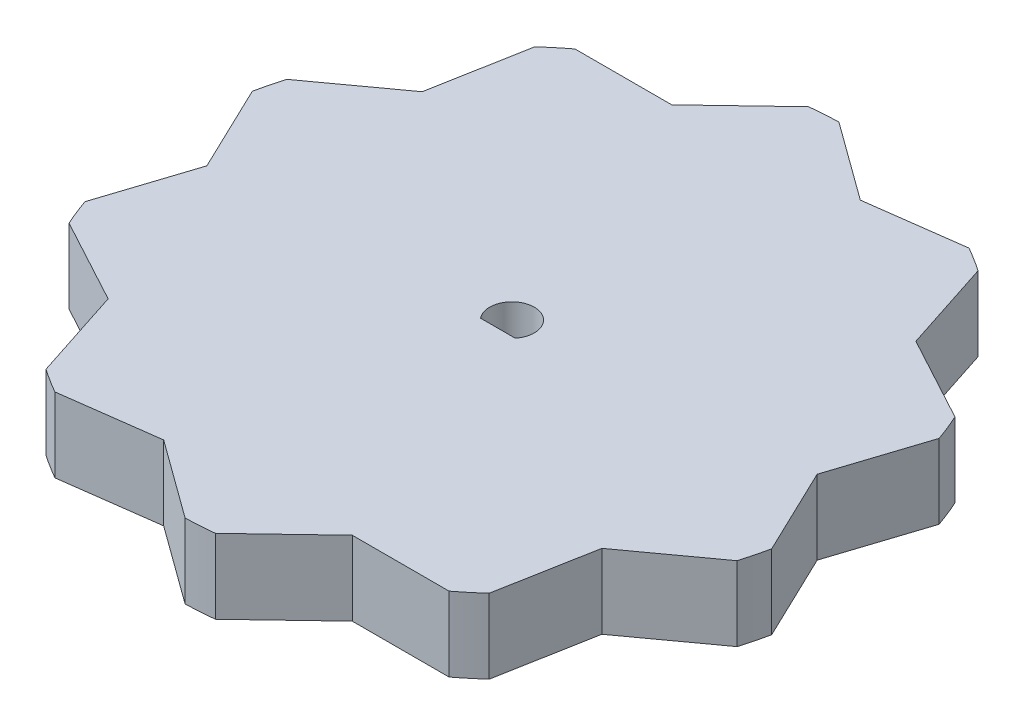
ISO-10303-21;
HEADER;
FILE_DESCRIPTION(('STEP AP214'),'2;1');
FILE_NAME('part.step','',(''),(''),'','','');
FILE_SCHEMA(('AUTOMOTIVE_DESIGN { 1 0 10303 214 1 1 1 1 }'));
ENDSEC;
DATA;
#1=APPLICATION_CONTEXT('core data for automotive mechanical design processes');
#2=APPLICATION_PROTOCOL_DEFINITION('international standard','automotive_design',2000,#1);
#3=PRODUCT_CONTEXT('',#1,'mechanical');
#4=PRODUCT('Part','Part','',(#3));
#5=PRODUCT_RELATED_PRODUCT_CATEGORY('part','',(#4));
#6=PRODUCT_DEFINITION_FORMATION('','',#4);
#7=PRODUCT_DEFINITION_CONTEXT('part definition',#1,'design');
#8=PRODUCT_DEFINITION('design','',#6,#7);
#9=PRODUCT_DEFINITION_SHAPE('','',#8);
#10=(LENGTH_UNIT() NAMED_UNIT(*) SI_UNIT(.MILLI.,.METRE.));
#11=(NAMED_UNIT(*) PLANE_ANGLE_UNIT() SI_UNIT($,.RADIAN.));
#12=(NAMED_UNIT(*) SI_UNIT($,.STERADIAN.) SOLID_ANGLE_UNIT());
#13=UNCERTAINTY_MEASURE_WITH_UNIT(LENGTH_MEASURE(1.E-05),#10,'distance_accuracy_value','');
#14=(GEOMETRIC_REPRESENTATION_CONTEXT(3) GLOBAL_UNCERTAINTY_ASSIGNED_CONTEXT((#13)) GLOBAL_UNIT_ASSIGNED_CONTEXT((#10,
#11,#12)) REPRESENTATION_CONTEXT('',''));
#15=CARTESIAN_POINT('',(0.,0.,0.));
#16=DIRECTION('',(0.,0.,1.));
#17=DIRECTION('',(1.,0.,0.));
#18=AXIS2_PLACEMENT_3D('',#15,#16,#17);
#19=CARTESIAN_POINT('',(0.,5.,0.));
#20=DIRECTION('',(0.,-1.,0.));
#21=DIRECTION('',(0.,0.,-1.));
#22=AXIS2_PLACEMENT_3D('',#19,#20,#21);
#23=CYLINDRICAL_SURFACE('',#22,22.5);
#24=CARTESIAN_POINT('',(0.,5.,0.));
#25=DIRECTION('',(0.,1.,0.));
#26=DIRECTION('',(0.,0.,1.));
#27=AXIS2_PLACEMENT_3D('',#24,#25,#26);
#28=CIRCLE('',#27,22.5);
#29=CARTESIAN_POINT('',(-21.5580930554665,5.,-6.44194254956119));
#30=VERTEX_POINT('',#29);
#31=CARTESIAN_POINT('',(-22.0282088774238,5.,-4.58344997273761));
#32=VERTEX_POINT('',#31);
#33=EDGE_CURVE('E446',#30,#32,#28,.T.);
#34=ORIENTED_EDGE('',*,*,#33,.F.);
#35=DIRECTION('',(0.,-1.,0.));
#36=VECTOR('',#35,1.);
#37=CARTESIAN_POINT('',(-21.5580930554665,84.7946583425231,-6.44194254956119));
#38=LINE('',#37,#36);
#39=CARTESIAN_POINT('',(-21.5580930554665,0.,-6.44194254956119));
#40=VERTEX_POINT('',#39);
#41=EDGE_CURVE('E447',#30,#40,#38,.T.);
#42=ORIENTED_EDGE('',*,*,#41,.T.);
#43=CARTESIAN_POINT('',(0.,0.,0.));
#44=DIRECTION('',(0.,1.,0.));
#45=DIRECTION('',(0.,0.,1.));
#46=AXIS2_PLACEMENT_3D('',#43,#44,#45);
#47=CIRCLE('',#46,22.5);
#48=CARTESIAN_POINT('',(-22.0282088774238,0.,-4.58344997273761));
#49=VERTEX_POINT('',#48);
#50=EDGE_CURVE('E272',#40,#49,#47,.T.);
#51=ORIENTED_EDGE('',*,*,#50,.T.);
#52=DIRECTION('',(0.,-1.,0.));
#53=VECTOR('',#52,1.);
#54=CARTESIAN_POINT('',(-22.0282088774238,84.7946583425231,-4.58344997273761));
#55=LINE('',#54,#53);
#56=EDGE_CURVE('E440',#32,#49,#55,.T.);
#57=ORIENTED_EDGE('',*,*,#56,.F.);
#58=EDGE_LOOP('',(#34,#42,#51,#57));
#59=FACE_BOUND('',#58,.T.);
#60=ADVANCED_FACE('F36',(#59),#23,.T.);
#61=CARTESIAN_POINT('',(-15.1271110388814,84.7946583425231,-16.6559452333799));
#62=DIRECTION('',(0.983599775987346,0.,0.180364854330443));
#63=DIRECTION('',(0.180364854330443,0.,-0.983599775987346));
#64=AXIS2_PLACEMENT_3D('',#61,#62,#63);
#65=PLANE('',#64);
#66=DIRECTION('',(0.,-1.,0.));
#67=VECTOR('',#66,1.);
#68=CARTESIAN_POINT('',(-16.2994825920293,84.7946583425231,-10.2625466894622));
#69=LINE('',#68,#67);
#70=CARTESIAN_POINT('',(-16.2994825920293,5.,-10.2625466894622));
#71=VERTEX_POINT('',#70);
#72=CARTESIAN_POINT('',(-16.2994825920293,0.,-10.2625466894622));
#73=VERTEX_POINT('',#72);
#74=EDGE_CURVE('E452',#71,#73,#69,.T.);
#75=ORIENTED_EDGE('',*,*,#74,.F.);
#76=DIRECTION('',(0.180364854330443,0.,-0.983599775987346));
#77=VECTOR('',#76,1.);
#78=CARTESIAN_POINT('',(-17.5898821681726,5.,-3.22549538176483));
#79=LINE('',#78,#77);
#80=CARTESIAN_POINT('',(-15.1271110388814,5.,-16.6559452333799));
#81=VERTEX_POINT('',#80);
#82=EDGE_CURVE('E457',#71,#81,#79,.T.);
#83=ORIENTED_EDGE('',*,*,#82,.T.);
#84=DIRECTION('',(0.,-1.,0.));
#85=VECTOR('',#84,1.);
#86=CARTESIAN_POINT('',(-15.1271110388814,84.7946583425231,-16.6559452333799));
#87=LINE('',#86,#85);
#88=CARTESIAN_POINT('',(-15.1271110388814,0.,-16.6559452333799));
#89=VERTEX_POINT('',#88);
#90=EDGE_CURVE('E44',#81,#89,#87,.T.);
#91=ORIENTED_EDGE('',*,*,#90,.T.);
#92=DIRECTION('',(0.180364854330443,0.,-0.983599775987346));
#93=VECTOR('',#92,1.);
#94=CARTESIAN_POINT('',(-17.5898821681726,0.,-3.22549538176483));
#95=LINE('',#94,#93);
#96=EDGE_CURVE('E12',#73,#89,#95,.T.);
#97=ORIENTED_EDGE('',*,*,#96,.F.);
#98=EDGE_LOOP('',(#75,#83,#91,#97));
#99=FACE_BOUND('',#98,.T.);
#100=ADVANCED_FACE('F38',(#99),#65,.F.);
#101=CARTESIAN_POINT('',(-16.2994825920293,84.7946583425231,-10.2625466894622));
#102=DIRECTION('',(0.587785252292462,0.,0.809016994374956));
#103=DIRECTION('',(0.809016994374956,0.,-0.587785252292462));
#104=AXIS2_PLACEMENT_3D('',#101,#102,#103);
#105=PLANE('',#104);
#106=ORIENTED_EDGE('',*,*,#41,.F.);
#107=DIRECTION('',(0.809016994374956,0.,-0.587785252292462));
#108=VECTOR('',#107,1.);
#109=CARTESIAN_POINT('',(-10.5114636871847,5.,-14.4677885767307));
#110=LINE('',#109,#108);
#111=EDGE_CURVE('E450',#30,#71,#110,.T.);
#112=ORIENTED_EDGE('',*,*,#111,.T.);
#113=ORIENTED_EDGE('',*,*,#74,.T.);
#114=DIRECTION('',(0.809016994374956,0.,-0.587785252292462));
#115=VECTOR('',#114,1.);
#116=CARTESIAN_POINT('',(-10.5114636871847,0.,-14.4677885767307));
#117=LINE('',#116,#115);
#118=EDGE_CURVE('E454',#40,#73,#117,.T.);
#119=ORIENTED_EDGE('',*,*,#118,.F.);
#120=EDGE_LOOP('',(#106,#112,#113,#119));
#121=FACE_BOUND('',#120,.T.);
#122=ADVANCED_FACE('F467',(#121),#105,.F.);
#123=CARTESIAN_POINT('',(-21.2273424749364,5.,7.4598881661699));
#124=VERTEX_POINT('',#123);
#125=CARTESIAN_POINT('',(-20.5152796360724,5.,9.23976739175571));
#126=VERTEX_POINT('',#125);
#127=EDGE_CURVE('E425',#124,#126,#28,.T.);
#128=ORIENTED_EDGE('',*,*,#127,.F.);
#129=DIRECTION('',(0.,-1.,0.));
#130=VECTOR('',#129,1.);
#131=CARTESIAN_POINT('',(-21.2273424749364,84.7946583425231,7.4598881661699));
#132=LINE('',#131,#130);
#133=CARTESIAN_POINT('',(-21.2273424749364,0.,7.4598881661699));
#134=VERTEX_POINT('',#133);
#135=EDGE_CURVE('E426',#124,#134,#132,.T.);
#136=ORIENTED_EDGE('',*,*,#135,.T.);
#137=CARTESIAN_POINT('',(-20.5152796360724,0.,9.23976739175571));
#138=VERTEX_POINT('',#137);
#139=EDGE_CURVE('E430',#134,#138,#47,.T.);
#140=ORIENTED_EDGE('',*,*,#139,.T.);
#141=DIRECTION('',(0.,-1.,0.));
#142=VECTOR('',#141,1.);
#143=CARTESIAN_POINT('',(-20.5152796360724,84.7946583425231,9.23976739175571));
#144=LINE('',#143,#142);
#145=EDGE_CURVE('E419',#126,#138,#144,.T.);
#146=ORIENTED_EDGE('',*,*,#145,.F.);
#147=EDGE_LOOP('',(#128,#136,#140,#146));
#148=FACE_BOUND('',#147,.T.);
#149=ADVANCED_FACE('F540',(#148),#23,.T.);
#150=CARTESIAN_POINT('',(-22.0282088774238,84.7946583425231,-4.58344997273761));
#151=DIRECTION('',(0.901764735844469,0.,-0.432227210142252));
#152=DIRECTION('',(-0.432227210142252,0.,-0.901764735844469));
#153=AXIS2_PLACEMENT_3D('',#150,#151,#152);
#154=PLANE('',#153);
#155=DIRECTION('',(0.,-1.,0.));
#156=VECTOR('',#155,1.);
#157=CARTESIAN_POINT('',(-19.2187320114991,84.7946583425231,1.27802081025144));
#158=LINE('',#157,#156);
#159=CARTESIAN_POINT('',(-19.2187320114991,5.,1.27802081025144));
#160=VERTEX_POINT('',#159);
#161=CARTESIAN_POINT('',(-19.2187320114991,0.,1.27802081025144));
#162=VERTEX_POINT('',#161);
#163=EDGE_CURVE('E432',#160,#162,#158,.T.);
#164=ORIENTED_EDGE('',*,*,#163,.F.);
#165=DIRECTION('',(-0.432227210142252,0.,-0.901764735844469));
#166=VECTOR('',#165,1.);
#167=CARTESIAN_POINT('',(-16.1264122198433,5.,7.72959274888853));
#168=LINE('',#167,#166);
#169=EDGE_CURVE('E437',#160,#32,#168,.T.);
#170=ORIENTED_EDGE('',*,*,#169,.T.);
#171=ORIENTED_EDGE('',*,*,#56,.T.);
#172=DIRECTION('',(-0.432227210142252,0.,-0.901764735844469));
#173=VECTOR('',#172,1.);
#174=CARTESIAN_POINT('',(-16.1264122198433,0.,7.72959274888853));
#175=LINE('',#174,#173);
#176=EDGE_CURVE('E443',#162,#49,#175,.T.);
#177=ORIENTED_EDGE('',*,*,#176,.F.);
#178=EDGE_LOOP('',(#164,#170,#171,#177));
#179=FACE_BOUND('',#178,.T.);
#180=ADVANCED_FACE('F478',(#179),#154,.F.);
#181=CARTESIAN_POINT('',(-19.2187320114991,84.7946583425231,1.27802081025144));
#182=DIRECTION('',(0.951056516295149,0.,0.309016994374961));
#183=DIRECTION('',(0.309016994374961,0.,-0.951056516295149));
#184=AXIS2_PLACEMENT_3D('',#181,#182,#183);
#185=PLANE('',#184);
#186=ORIENTED_EDGE('',*,*,#135,.F.);
#187=DIRECTION('',(0.309016994374961,0.,-0.951056516295149));
#188=VECTOR('',#187,1.);
#189=CARTESIAN_POINT('',(-17.0079055173754,5.,-5.52620349426384));
#190=LINE('',#189,#188);
#191=EDGE_CURVE('E429',#124,#160,#190,.T.);
#192=ORIENTED_EDGE('',*,*,#191,.T.);
#193=ORIENTED_EDGE('',*,*,#163,.T.);
#194=DIRECTION('',(0.309016994374961,0.,-0.951056516295149));
#195=VECTOR('',#194,1.);
#196=CARTESIAN_POINT('',(-17.0079055173754,0.,-5.52620349426384));
#197=LINE('',#196,#195);
#198=EDGE_CURVE('E434',#134,#162,#197,.T.);
#199=ORIENTED_EDGE('',*,*,#198,.F.);
#200=EDGE_LOOP('',(#186,#192,#193,#199));
#201=FACE_BOUND('',#200,.T.);
#202=ADVANCED_FACE('F551',(#201),#185,.F.);
#203=CARTESIAN_POINT('',(-12.7884685598149,5.,18.5122951546972));
#204=VERTEX_POINT('',#203);
#205=CARTESIAN_POINT('',(-11.16621086245,5.,19.5337076607413));
#206=VERTEX_POINT('',#205);
#207=EDGE_CURVE('E404',#204,#206,#28,.T.);
#208=ORIENTED_EDGE('',*,*,#207,.F.);
#209=DIRECTION('',(0.,-1.,0.));
#210=VECTOR('',#209,1.);
#211=CARTESIAN_POINT('',(-12.7884685598149,84.7946583425231,18.5122951546972));
#212=LINE('',#211,#210);
#213=CARTESIAN_POINT('',(-12.7884685598149,0.,18.5122951546972));
#214=VERTEX_POINT('',#213);
#215=EDGE_CURVE('E405',#204,#214,#212,.T.);
#216=ORIENTED_EDGE('',*,*,#215,.T.);
#217=CARTESIAN_POINT('',(-11.16621086245,0.,19.5337076607413));
#218=VERTEX_POINT('',#217);
#219=EDGE_CURVE('E409',#214,#218,#47,.T.);
#220=ORIENTED_EDGE('',*,*,#219,.T.);
#221=DIRECTION('',(0.,-1.,0.));
#222=VECTOR('',#221,1.);
#223=CARTESIAN_POINT('',(-11.16621086245,84.7946583425231,19.5337076607413));
#224=LINE('',#223,#222);
#225=EDGE_CURVE('E398',#206,#218,#224,.T.);
#226=ORIENTED_EDGE('',*,*,#225,.F.);
#227=EDGE_LOOP('',(#208,#216,#220,#226));
#228=FACE_BOUND('',#227,.T.);
#229=ADVANCED_FACE('F546',(#228),#23,.T.);
#230=CARTESIAN_POINT('',(-20.5152796360724,84.7946583425231,9.23976739175571));
#231=DIRECTION('',(0.475486216465076,0.,-0.87972317120315));
#232=DIRECTION('',(-0.87972317120315,0.,-0.475486216465076));
#233=AXIS2_PLACEMENT_3D('',#230,#231,#232);
#234=PLANE('',#233);
#235=DIRECTION('',(0.,-1.,0.));
#236=VECTOR('',#235,1.);
#237=CARTESIAN_POINT('',(-14.7970790232519,84.7946583425231,12.3304277987787));
#238=LINE('',#237,#236);
#239=CARTESIAN_POINT('',(-14.7970790232519,5.,12.3304277987787));
#240=VERTEX_POINT('',#239);
#241=CARTESIAN_POINT('',(-14.7970790232519,0.,12.3304277987787));
#242=VERTEX_POINT('',#241);
#243=EDGE_CURVE('E411',#240,#242,#238,.T.);
#244=ORIENTED_EDGE('',*,*,#243,.F.);
#245=DIRECTION('',(-0.87972317120315,0.,-0.475486216465076));
#246=VECTOR('',#245,1.);
#247=CARTESIAN_POINT('',(-8.50320092012553,5.,15.7322391686612));
#248=LINE('',#247,#246);
#249=EDGE_CURVE('E416',#240,#126,#248,.T.);
#250=ORIENTED_EDGE('',*,*,#249,.T.);
#251=ORIENTED_EDGE('',*,*,#145,.T.);
#252=DIRECTION('',(-0.87972317120315,0.,-0.475486216465076));
#253=VECTOR('',#252,1.);
#254=CARTESIAN_POINT('',(-8.50320092012553,0.,15.7322391686612));
#255=LINE('',#254,#253);
#256=EDGE_CURVE('E422',#242,#138,#255,.T.);
#257=ORIENTED_EDGE('',*,*,#256,.F.);
#258=EDGE_LOOP('',(#244,#250,#251,#257));
#259=FACE_BOUND('',#258,.T.);
#260=ADVANCED_FACE('F554',(#259),#234,.F.);
#261=CARTESIAN_POINT('',(-14.7970790232519,84.7946583425231,12.3304277987787));
#262=DIRECTION('',(0.951056516295158,0.,-0.309016994374934));
#263=DIRECTION('',(-0.309016994374934,0.,-0.951056516295158));
#264=AXIS2_PLACEMENT_3D('',#261,#262,#263);
#265=PLANE('',#264);
#266=ORIENTED_EDGE('',*,*,#215,.F.);
#267=DIRECTION('',(-0.309016994374934,0.,-0.951056516295158));
#268=VECTOR('',#267,1.);
#269=CARTESIAN_POINT('',(-17.0079055173755,5.,5.52620349426336));
#270=LINE('',#269,#268);
#271=EDGE_CURVE('E408',#204,#240,#270,.T.);
#272=ORIENTED_EDGE('',*,*,#271,.T.);
#273=ORIENTED_EDGE('',*,*,#243,.T.);
#274=DIRECTION('',(-0.309016994374934,0.,-0.951056516295158));
#275=VECTOR('',#274,1.);
#276=CARTESIAN_POINT('',(-17.0079055173755,0.,5.52620349426336));
#277=LINE('',#276,#275);
#278=EDGE_CURVE('E413',#214,#242,#277,.T.);
#279=ORIENTED_EDGE('',*,*,#278,.F.);
#280=EDGE_LOOP('',(#266,#272,#273,#279));
#281=FACE_BOUND('',#280,.T.);
#282=ADVANCED_FACE('F560',(#281),#265,.F.);
#283=CARTESIAN_POINT('',(0.535165681096494,5.,22.4936346039002));
#284=VERTEX_POINT('',#283);
#285=CARTESIAN_POINT('',(2.44797093508008,5.,22.3664355296279));
#286=VERTEX_POINT('',#285);
#287=EDGE_CURVE('E383',#284,#286,#28,.T.);
#288=ORIENTED_EDGE('',*,*,#287,.F.);
#289=DIRECTION('',(0.,-1.,0.));
#290=VECTOR('',#289,1.);
#291=CARTESIAN_POINT('',(0.535165681096494,84.7946583425231,22.4936346039002));
#292=LINE('',#291,#290);
#293=CARTESIAN_POINT('',(0.535165681096494,0.,22.4936346039002));
#294=VERTEX_POINT('',#293);
#295=EDGE_CURVE('E384',#284,#294,#292,.T.);
#296=ORIENTED_EDGE('',*,*,#295,.T.);
#297=CARTESIAN_POINT('',(2.44797093508008,0.,22.3664355296279));
#298=VERTEX_POINT('',#297);
#299=EDGE_CURVE('E388',#294,#298,#47,.T.);
#300=ORIENTED_EDGE('',*,*,#299,.T.);
#301=DIRECTION('',(0.,-1.,0.));
#302=VECTOR('',#301,1.);
#303=CARTESIAN_POINT('',(2.44797093508008,84.7946583425231,22.3664355296279));
#304=LINE('',#303,#302);
#305=EDGE_CURVE('E377',#286,#298,#304,.T.);
#306=ORIENTED_EDGE('',*,*,#305,.F.);
#307=EDGE_LOOP('',(#288,#296,#300,#306));
#308=FACE_BOUND('',#307,.T.);
#309=ADVANCED_FACE('F555',(#308),#23,.T.);
#310=CARTESIAN_POINT('',(-11.16621086245,84.7946583425231,19.5337076607413));
#311=DIRECTION('',(-0.132411876421887,0.,-0.991194781555288));
#312=DIRECTION('',(-0.991194781555288,0.,0.132411876421887));
#313=AXIS2_PLACEMENT_3D('',#310,#311,#312);
#314=PLANE('',#313);
#315=DIRECTION('',(0.,-1.,0.));
#316=VECTOR('',#315,1.);
#317=CARTESIAN_POINT('',(-4.72344478234061,84.7946583425231,18.6730304639991));
#318=LINE('',#317,#316);
#319=CARTESIAN_POINT('',(-4.72344478234061,5.,18.6730304639991));
#320=VERTEX_POINT('',#319);
#321=CARTESIAN_POINT('',(-4.72344478234061,0.,18.6730304639991));
#322=VERTEX_POINT('',#321);
#323=EDGE_CURVE('E390',#320,#322,#318,.T.);
#324=ORIENTED_EDGE('',*,*,#323,.F.);
#325=DIRECTION('',(-0.991194781555288,0.,0.132411876421887));
#326=VECTOR('',#325,1.);
#327=CARTESIAN_POINT('',(2.3679441179108,5.,17.7257049451477));
#328=LINE('',#327,#326);
#329=EDGE_CURVE('E395',#320,#206,#328,.T.);
#330=ORIENTED_EDGE('',*,*,#329,.T.);
#331=ORIENTED_EDGE('',*,*,#225,.T.);
#332=DIRECTION('',(-0.991194781555288,0.,0.132411876421887));
#333=VECTOR('',#332,1.);
#334=CARTESIAN_POINT('',(2.3679441179108,0.,17.7257049451477));
#335=LINE('',#334,#333);
#336=EDGE_CURVE('E401',#322,#218,#335,.T.);
#337=ORIENTED_EDGE('',*,*,#336,.F.);
#338=EDGE_LOOP('',(#324,#330,#331,#337));
#339=FACE_BOUND('',#338,.T.);
#340=ADVANCED_FACE('F566',(#339),#314,.F.);
#341=CARTESIAN_POINT('',(-4.72344478234061,84.7946583425231,18.6730304639991));
#342=DIRECTION('',(0.587785252292485,0.,-0.809016994374939));
#343=DIRECTION('',(-0.809016994374939,0.,-0.587785252292485));
#344=AXIS2_PLACEMENT_3D('',#341,#342,#343);
#345=PLANE('',#344);
#346=ORIENTED_EDGE('',*,*,#295,.F.);
#347=DIRECTION('',(-0.809016994374939,0.,-0.587785252292485));
#348=VECTOR('',#347,1.);
#349=CARTESIAN_POINT('',(-10.5114636871851,5.,14.4677885767304));
#350=LINE('',#349,#348);
#351=EDGE_CURVE('E387',#284,#320,#350,.T.);
#352=ORIENTED_EDGE('',*,*,#351,.T.);
#353=ORIENTED_EDGE('',*,*,#323,.T.);
#354=DIRECTION('',(-0.809016994374939,0.,-0.587785252292485));
#355=VECTOR('',#354,1.);
#356=CARTESIAN_POINT('',(-10.5114636871851,0.,14.4677885767304));
#357=LINE('',#356,#355);
#358=EDGE_CURVE('E392',#294,#322,#357,.T.);
#359=ORIENTED_EDGE('',*,*,#358,.F.);
#360=EDGE_LOOP('',(#346,#352,#353,#359));
#361=FACE_BOUND('',#360,.T.);
#362=ADVANCED_FACE('F572',(#361),#345,.F.);
#363=CARTESIAN_POINT('',(13.6543848214415,5.,17.8831701649341));
#364=VERTEX_POINT('',#363);
#365=CARTESIAN_POINT('',(15.1271110388816,5.,16.6559452333797));
#366=VERTEX_POINT('',#365);
#367=EDGE_CURVE('E362',#364,#366,#28,.T.);
#368=ORIENTED_EDGE('',*,*,#367,.F.);
#369=DIRECTION('',(0.,-1.,0.));
#370=VECTOR('',#369,1.);
#371=CARTESIAN_POINT('',(13.6543848214415,84.7946583425231,17.8831701649341));
#372=LINE('',#371,#370);
#373=CARTESIAN_POINT('',(13.6543848214415,0.,17.8831701649341));
#374=VERTEX_POINT('',#373);
#375=EDGE_CURVE('E363',#364,#374,#372,.T.);
#376=ORIENTED_EDGE('',*,*,#375,.T.);
#377=CARTESIAN_POINT('',(15.1271110388816,0.,16.6559452333797));
#378=VERTEX_POINT('',#377);
#379=EDGE_CURVE('E367',#374,#378,#47,.T.);
#380=ORIENTED_EDGE('',*,*,#379,.T.);
#381=DIRECTION('',(0.,-1.,0.));
#382=VECTOR('',#381,1.);
#383=CARTESIAN_POINT('',(15.1271110388816,84.7946583425231,16.6559452333797));
#384=LINE('',#383,#382);
#385=EDGE_CURVE('E356',#366,#378,#384,.T.);
#386=ORIENTED_EDGE('',*,*,#385,.F.);
#387=EDGE_LOOP('',(#368,#376,#380,#386));
#388=FACE_BOUND('',#387,.T.);
#389=ADVANCED_FACE('F567',(#388),#23,.T.);
#390=CARTESIAN_POINT('',(2.44797093508008,84.7946583425231,22.3664355296279));
#391=DIRECTION('',(-0.68973313302984,0.,-0.724063674824833));
#392=DIRECTION('',(-0.724063674824833,0.,0.68973313302984));
#393=AXIS2_PLACEMENT_3D('',#390,#391,#392);
#394=PLANE('',#393);
#395=DIRECTION('',(0.,-1.,0.));
#396=VECTOR('',#395,1.);
#397=CARTESIAN_POINT('',(7.15438482144149,84.7946583425231,17.883170164934));
#398=LINE('',#397,#396);
#399=CARTESIAN_POINT('',(7.15438482144149,5.,17.883170164934));
#400=VERTEX_POINT('',#399);
#401=CARTESIAN_POINT('',(7.15438482144149,0.,17.883170164934));
#402=VERTEX_POINT('',#401);
#403=EDGE_CURVE('E369',#400,#402,#398,.T.);
#404=ORIENTED_EDGE('',*,*,#403,.F.);
#405=DIRECTION('',(-0.724063674824833,0.,0.68973313302984));
#406=VECTOR('',#405,1.);
#407=CARTESIAN_POINT('',(12.3346149863656,5.,12.9485539071398));
#408=LINE('',#407,#406);
#409=EDGE_CURVE('E374',#400,#286,#408,.T.);
#410=ORIENTED_EDGE('',*,*,#409,.T.);
#411=ORIENTED_EDGE('',*,*,#305,.T.);
#412=DIRECTION('',(-0.724063674824833,0.,0.68973313302984));
#413=VECTOR('',#412,1.);
#414=CARTESIAN_POINT('',(12.3346149863656,0.,12.9485539071398));
#415=LINE('',#414,#413);
#416=EDGE_CURVE('E380',#402,#298,#415,.T.);
#417=ORIENTED_EDGE('',*,*,#416,.F.);
#418=EDGE_LOOP('',(#404,#410,#411,#417));
#419=FACE_BOUND('',#418,.T.);
#420=ADVANCED_FACE('F578',(#419),#394,.F.);
#421=CARTESIAN_POINT('',(7.15438482144149,84.7946583425231,17.883170164934));
#422=DIRECTION('',(0.,0.,-1.));
#423=DIRECTION('',(-1.,0.,0.));
#424=AXIS2_PLACEMENT_3D('',#421,#422,#423);
#425=PLANE('',#424);
#426=ORIENTED_EDGE('',*,*,#375,.F.);
#427=DIRECTION('',(-1.,0.,0.));
#428=VECTOR('',#427,1.);
#429=CARTESIAN_POINT('',(-2.51945076351001E-13,5.,17.8831701649339));
#430=LINE('',#429,#428);
#431=EDGE_CURVE('E366',#364,#400,#430,.T.);
#432=ORIENTED_EDGE('',*,*,#431,.T.);
#433=ORIENTED_EDGE('',*,*,#403,.T.);
#434=DIRECTION('',(-1.,0.,0.));
#435=VECTOR('',#434,1.);
#436=CARTESIAN_POINT('',(-2.51945076351001E-13,0.,17.8831701649339));
#437=LINE('',#436,#435);
#438=EDGE_CURVE('E371',#374,#402,#437,.T.);
#439=ORIENTED_EDGE('',*,*,#438,.F.);
#440=EDGE_LOOP('',(#426,#432,#433,#439));
#441=FACE_BOUND('',#440,.T.);
#442=ADVANCED_FACE('F584',(#441),#425,.F.);
#443=CARTESIAN_POINT('',(21.5580930554666,5.,6.4419425495609));
#444=VERTEX_POINT('',#443);
#445=CARTESIAN_POINT('',(22.0282088774238,5.,4.58344997273731));
#446=VERTEX_POINT('',#445);
#447=EDGE_CURVE('E341',#444,#446,#28,.T.);
#448=ORIENTED_EDGE('',*,*,#447,.F.);
#449=DIRECTION('',(0.,-1.,0.));
#450=VECTOR('',#449,1.);
#451=CARTESIAN_POINT('',(21.5580930554666,84.7946583425231,6.4419425495609));
#452=LINE('',#451,#450);
#453=CARTESIAN_POINT('',(21.5580930554666,0.,6.4419425495609));
#454=VERTEX_POINT('',#453);
#455=EDGE_CURVE('E342',#444,#454,#452,.T.);
#456=ORIENTED_EDGE('',*,*,#455,.T.);
#457=CARTESIAN_POINT('',(22.0282088774238,0.,4.58344997273731));
#458=VERTEX_POINT('',#457);
#459=EDGE_CURVE('E346',#454,#458,#47,.T.);
#460=ORIENTED_EDGE('',*,*,#459,.T.);
#461=DIRECTION('',(0.,-1.,0.));
#462=VECTOR('',#461,1.);
#463=CARTESIAN_POINT('',(22.0282088774238,84.7946583425231,4.58344997273731));
#464=LINE('',#463,#462);
#465=EDGE_CURVE('E335',#446,#458,#464,.T.);
#466=ORIENTED_EDGE('',*,*,#465,.F.);
#467=EDGE_LOOP('',(#448,#456,#460,#466));
#468=FACE_BOUND('',#467,.T.);
#469=ADVANCED_FACE('F579',(#468),#23,.T.);
#470=CARTESIAN_POINT('',(15.1271110388816,84.7946583425231,16.6559452333797));
#471=DIRECTION('',(-0.983599775987349,0.,-0.18036485433043));
#472=DIRECTION('',(-0.18036485433043,0.,0.983599775987349));
#473=AXIS2_PLACEMENT_3D('',#470,#471,#472);
#474=PLANE('',#473);
#475=DIRECTION('',(0.,-1.,0.));
#476=VECTOR('',#475,1.);
#477=CARTESIAN_POINT('',(16.2994825920294,84.7946583425231,10.262546689462));
#478=LINE('',#477,#476);
#479=CARTESIAN_POINT('',(16.2994825920294,5.,10.262546689462));
#480=VERTEX_POINT('',#479);
#481=CARTESIAN_POINT('',(16.2994825920294,0.,10.262546689462));
#482=VERTEX_POINT('',#481);
#483=EDGE_CURVE('E348',#480,#482,#478,.T.);
#484=ORIENTED_EDGE('',*,*,#483,.F.);
#485=DIRECTION('',(-0.18036485433043,0.,0.983599775987349));
#486=VECTOR('',#485,1.);
#487=CARTESIAN_POINT('',(17.5898821681726,5.,3.22549538176459));
#488=LINE('',#487,#486);
#489=EDGE_CURVE('E353',#480,#366,#488,.T.);
#490=ORIENTED_EDGE('',*,*,#489,.T.);
#491=ORIENTED_EDGE('',*,*,#385,.T.);
#492=DIRECTION('',(-0.18036485433043,0.,0.983599775987349));
#493=VECTOR('',#492,1.);
#494=CARTESIAN_POINT('',(17.5898821681726,0.,3.22549538176459));
#495=LINE('',#494,#493);
#496=EDGE_CURVE('E359',#482,#378,#495,.T.);
#497=ORIENTED_EDGE('',*,*,#496,.F.);
#498=EDGE_LOOP('',(#484,#490,#491,#497));
#499=FACE_BOUND('',#498,.T.);
#500=ADVANCED_FACE('F590',(#499),#474,.F.);
#501=CARTESIAN_POINT('',(16.2994825920294,84.7946583425231,10.262546689462));
#502=DIRECTION('',(-0.587785252292473,0.,-0.809016994374948));
#503=DIRECTION('',(-0.809016994374948,0.,0.587785252292473));
#504=AXIS2_PLACEMENT_3D('',#501,#502,#503);
#505=PLANE('',#504);
#506=ORIENTED_EDGE('',*,*,#455,.F.);
#507=DIRECTION('',(-0.809016994374948,0.,0.587785252292473));
#508=VECTOR('',#507,1.);
#509=CARTESIAN_POINT('',(10.5114636871849,5.,14.4677885767305));
#510=LINE('',#509,#508);
#511=EDGE_CURVE('E345',#444,#480,#510,.T.);
#512=ORIENTED_EDGE('',*,*,#511,.T.);
#513=ORIENTED_EDGE('',*,*,#483,.T.);
#514=DIRECTION('',(-0.809016994374948,0.,0.587785252292473));
#515=VECTOR('',#514,1.);
#516=CARTESIAN_POINT('',(10.5114636871849,0.,14.4677885767305));
#517=LINE('',#516,#515);
#518=EDGE_CURVE('E350',#454,#482,#517,.T.);
#519=ORIENTED_EDGE('',*,*,#518,.F.);
#520=EDGE_LOOP('',(#506,#512,#513,#519));
#521=FACE_BOUND('',#520,.T.);
#522=ADVANCED_FACE('F596',(#521),#505,.F.);
#523=CARTESIAN_POINT('',(21.2273424749363,5.,-7.4598881661702));
#524=VERTEX_POINT('',#523);
#525=CARTESIAN_POINT('',(20.5152796360723,5.,-9.23976739175599));
#526=VERTEX_POINT('',#525);
#527=EDGE_CURVE('E320',#524,#526,#28,.T.);
#528=ORIENTED_EDGE('',*,*,#527,.F.);
#529=DIRECTION('',(0.,-1.,0.));
#530=VECTOR('',#529,1.);
#531=CARTESIAN_POINT('',(21.2273424749363,84.7946583425231,-7.4598881661702));
#532=LINE('',#531,#530);
#533=CARTESIAN_POINT('',(21.2273424749363,0.,-7.4598881661702));
#534=VERTEX_POINT('',#533);
#535=EDGE_CURVE('E321',#524,#534,#532,.T.);
#536=ORIENTED_EDGE('',*,*,#535,.T.);
#537=CARTESIAN_POINT('',(20.5152796360723,0.,-9.23976739175599));
#538=VERTEX_POINT('',#537);
#539=EDGE_CURVE('E325',#534,#538,#47,.T.);
#540=ORIENTED_EDGE('',*,*,#539,.T.);
#541=DIRECTION('',(0.,-1.,0.));
#542=VECTOR('',#541,1.);
#543=CARTESIAN_POINT('',(20.5152796360723,84.7946583425231,-9.23976739175599));
#544=LINE('',#543,#542);
#545=EDGE_CURVE('E314',#526,#538,#544,.T.);
#546=ORIENTED_EDGE('',*,*,#545,.F.);
#547=EDGE_LOOP('',(#528,#536,#540,#546));
#548=FACE_BOUND('',#547,.T.);
#549=ADVANCED_FACE('F591',(#548),#23,.T.);
#550=CARTESIAN_POINT('',(22.0282088774238,84.7946583425231,4.58344997273731));
#551=DIRECTION('',(-0.901764735844463,0.,0.432227210142265));
#552=DIRECTION('',(0.432227210142265,0.,0.901764735844463));
#553=AXIS2_PLACEMENT_3D('',#550,#551,#552);
#554=PLANE('',#553);
#555=DIRECTION('',(0.,-1.,0.));
#556=VECTOR('',#555,1.);
#557=CARTESIAN_POINT('',(19.2187320114991,84.7946583425231,-1.2780208102517));
#558=LINE('',#557,#556);
#559=CARTESIAN_POINT('',(19.2187320114991,5.,-1.2780208102517));
#560=VERTEX_POINT('',#559);
#561=CARTESIAN_POINT('',(19.2187320114991,0.,-1.2780208102517));
#562=VERTEX_POINT('',#561);
#563=EDGE_CURVE('E327',#560,#562,#558,.T.);
#564=ORIENTED_EDGE('',*,*,#563,.F.);
#565=DIRECTION('',(0.432227210142265,0.,0.901764735844463));
#566=VECTOR('',#565,1.);
#567=CARTESIAN_POINT('',(16.1264122198432,5.,-7.72959274888875));
#568=LINE('',#567,#566);
#569=EDGE_CURVE('E332',#560,#446,#568,.T.);
#570=ORIENTED_EDGE('',*,*,#569,.T.);
#571=ORIENTED_EDGE('',*,*,#465,.T.);
#572=DIRECTION('',(0.432227210142265,0.,0.901764735844463));
#573=VECTOR('',#572,1.);
#574=CARTESIAN_POINT('',(16.1264122198432,0.,-7.72959274888875));
#575=LINE('',#574,#573);
#576=EDGE_CURVE('E338',#562,#458,#575,.T.);
#577=ORIENTED_EDGE('',*,*,#576,.F.);
#578=EDGE_LOOP('',(#564,#570,#571,#577));
#579=FACE_BOUND('',#578,.T.);
#580=ADVANCED_FACE('F602',(#579),#554,.F.);
#581=CARTESIAN_POINT('',(19.2187320114991,84.7946583425231,-1.2780208102517));
#582=DIRECTION('',(-0.951056516295154,0.,-0.309016994374948));
#583=DIRECTION('',(-0.309016994374948,0.,0.951056516295154));
#584=AXIS2_PLACEMENT_3D('',#581,#582,#583);
#585=PLANE('',#584);
#586=ORIENTED_EDGE('',*,*,#535,.F.);
#587=DIRECTION('',(-0.309016994374948,0.,0.951056516295154));
#588=VECTOR('',#587,1.);
#589=CARTESIAN_POINT('',(17.0079055173754,5.,5.5262034942636));
#590=LINE('',#589,#588);
#591=EDGE_CURVE('E324',#524,#560,#590,.T.);
#592=ORIENTED_EDGE('',*,*,#591,.T.);
#593=ORIENTED_EDGE('',*,*,#563,.T.);
#594=DIRECTION('',(-0.309016994374948,0.,0.951056516295154));
#595=VECTOR('',#594,1.);
#596=CARTESIAN_POINT('',(17.0079055173754,0.,5.5262034942636));
#597=LINE('',#596,#595);
#598=EDGE_CURVE('E329',#534,#562,#597,.T.);
#599=ORIENTED_EDGE('',*,*,#598,.F.);
#600=EDGE_LOOP('',(#586,#592,#593,#599));
#601=FACE_BOUND('',#600,.T.);
#602=ADVANCED_FACE('F608',(#601),#585,.F.);
#603=CARTESIAN_POINT('',(12.7884685598146,5.,-18.5122951546974));
#604=VERTEX_POINT('',#603);
#605=CARTESIAN_POINT('',(11.1662108624497,5.,-19.5337076607415));
#606=VERTEX_POINT('',#605);
#607=EDGE_CURVE('E299',#604,#606,#28,.T.);
#608=ORIENTED_EDGE('',*,*,#607,.F.);
#609=DIRECTION('',(0.,-1.,0.));
#610=VECTOR('',#609,1.);
#611=CARTESIAN_POINT('',(12.7884685598146,84.7946583425231,-18.5122951546974));
#612=LINE('',#611,#610);
#613=CARTESIAN_POINT('',(12.7884685598146,0.,-18.5122951546974));
#614=VERTEX_POINT('',#613);
#615=EDGE_CURVE('E300',#604,#614,#612,.T.);
#616=ORIENTED_EDGE('',*,*,#615,.T.);
#617=CARTESIAN_POINT('',(11.1662108624497,0.,-19.5337076607415));
#618=VERTEX_POINT('',#617);
#619=EDGE_CURVE('E304',#614,#618,#47,.T.);
#620=ORIENTED_EDGE('',*,*,#619,.T.);
#621=DIRECTION('',(0.,-1.,0.));
#622=VECTOR('',#621,1.);
#623=CARTESIAN_POINT('',(11.1662108624497,84.7946583425231,-19.5337076607415));
#624=LINE('',#623,#622);
#625=EDGE_CURVE('E293',#606,#618,#624,.T.);
#626=ORIENTED_EDGE('',*,*,#625,.F.);
#627=EDGE_LOOP('',(#608,#616,#620,#626));
#628=FACE_BOUND('',#627,.T.);
#629=ADVANCED_FACE('F603',(#628),#23,.T.);
#630=CARTESIAN_POINT('',(20.5152796360723,84.7946583425231,-9.23976739175599));
#631=DIRECTION('',(-0.475486216465063,0.,0.879723171203157));
#632=DIRECTION('',(0.879723171203157,0.,0.475486216465063));
#633=AXIS2_PLACEMENT_3D('',#630,#631,#632);
#634=PLANE('',#633);
#635=DIRECTION('',(0.,-1.,0.));
#636=VECTOR('',#635,1.);
#637=CARTESIAN_POINT('',(14.7970790232518,84.7946583425231,-12.3304277987789));
#638=LINE('',#637,#636);
#639=CARTESIAN_POINT('',(14.7970790232518,5.,-12.3304277987789));
#640=VERTEX_POINT('',#639);
#641=CARTESIAN_POINT('',(14.7970790232518,0.,-12.3304277987789));
#642=VERTEX_POINT('',#641);
#643=EDGE_CURVE('E306',#640,#642,#638,.T.);
#644=ORIENTED_EDGE('',*,*,#643,.F.);
#645=DIRECTION('',(0.879723171203157,0.,0.475486216465063));
#646=VECTOR('',#645,1.);
#647=CARTESIAN_POINT('',(8.50320092012532,5.,-15.7322391686613));
#648=LINE('',#647,#646);
#649=EDGE_CURVE('E311',#640,#526,#648,.T.);
#650=ORIENTED_EDGE('',*,*,#649,.T.);
#651=ORIENTED_EDGE('',*,*,#545,.T.);
#652=DIRECTION('',(0.879723171203157,0.,0.475486216465063));
#653=VECTOR('',#652,1.);
#654=CARTESIAN_POINT('',(8.50320092012532,0.,-15.7322391686613));
#655=LINE('',#654,#653);
#656=EDGE_CURVE('E317',#642,#538,#655,.T.);
#657=ORIENTED_EDGE('',*,*,#656,.F.);
#658=EDGE_LOOP('',(#644,#650,#651,#657));
#659=FACE_BOUND('',#658,.T.);
#660=ADVANCED_FACE('F614',(#659),#634,.F.);
#661=CARTESIAN_POINT('',(14.7970790232518,84.7946583425231,-12.3304277987789));
#662=DIRECTION('',(-0.951056516295154,0.,0.309016994374947));
#663=DIRECTION('',(0.309016994374947,0.,0.951056516295154));
#664=AXIS2_PLACEMENT_3D('',#661,#662,#663);
#665=PLANE('',#664);
#666=ORIENTED_EDGE('',*,*,#615,.F.);
#667=DIRECTION('',(0.309016994374947,0.,0.951056516295154));
#668=VECTOR('',#667,1.);
#669=CARTESIAN_POINT('',(17.0079055173754,5.,-5.5262034942636));
#670=LINE('',#669,#668);
#671=EDGE_CURVE('E303',#604,#640,#670,.T.);
#672=ORIENTED_EDGE('',*,*,#671,.T.);
#673=ORIENTED_EDGE('',*,*,#643,.T.);
#674=DIRECTION('',(0.309016994374947,0.,0.951056516295154));
#675=VECTOR('',#674,1.);
#676=CARTESIAN_POINT('',(17.0079055173754,0.,-5.5262034942636));
#677=LINE('',#676,#675);
#678=EDGE_CURVE('E308',#614,#642,#677,.T.);
#679=ORIENTED_EDGE('',*,*,#678,.F.);
#680=EDGE_LOOP('',(#666,#672,#673,#679));
#681=FACE_BOUND('',#680,.T.);
#682=ADVANCED_FACE('F619',(#681),#665,.F.);
#683=CARTESIAN_POINT('',(-0.535165681096822,5.,-22.4936346039002));
#684=VERTEX_POINT('',#683);
#685=CARTESIAN_POINT('',(-2.44797093508039,5.,-22.3664355296279));
#686=VERTEX_POINT('',#685);
#687=EDGE_CURVE('E495',#684,#686,#28,.T.);
#688=ORIENTED_EDGE('',*,*,#687,.F.);
#689=DIRECTION('',(0.,-1.,0.));
#690=VECTOR('',#689,1.);
#691=CARTESIAN_POINT('',(-0.535165681096822,84.7946583425231,-22.4936346039002));
#692=LINE('',#691,#690);
#693=CARTESIAN_POINT('',(-0.535165681096822,0.,-22.4936346039002));
#694=VERTEX_POINT('',#693);
#695=EDGE_CURVE('E280',#684,#694,#692,.T.);
#696=ORIENTED_EDGE('',*,*,#695,.T.);
#697=CARTESIAN_POINT('',(-2.44797093508039,0.,-22.3664355296279));
#698=VERTEX_POINT('',#697);
#699=EDGE_CURVE('E273',#694,#698,#47,.T.);
#700=ORIENTED_EDGE('',*,*,#699,.T.);
#701=DIRECTION('',(0.,-1.,0.));
#702=VECTOR('',#701,1.);
#703=CARTESIAN_POINT('',(-2.44797093508039,84.7946583425231,-22.3664355296279));
#704=LINE('',#703,#702);
#705=EDGE_CURVE('E514',#686,#698,#704,.T.);
#706=ORIENTED_EDGE('',*,*,#705,.F.);
#707=EDGE_LOOP('',(#688,#696,#700,#706));
#708=FACE_BOUND('',#707,.T.);
#709=ADVANCED_FACE('F537',(#708),#23,.T.);
#710=CARTESIAN_POINT('',(11.1662108624497,84.7946583425231,-19.5337076607415));
#711=DIRECTION('',(0.132411876421902,0.,0.991194781555286));
#712=DIRECTION('',(0.991194781555286,0.,-0.132411876421902));
#713=AXIS2_PLACEMENT_3D('',#710,#711,#712);
#714=PLANE('',#713);
#715=DIRECTION('',(0.,-1.,0.));
#716=VECTOR('',#715,1.);
#717=CARTESIAN_POINT('',(4.72344478234034,84.7946583425231,-18.6730304639991));
#718=LINE('',#717,#716);
#719=CARTESIAN_POINT('',(4.72344478234034,5.,-18.6730304639991));
#720=VERTEX_POINT('',#719);
#721=CARTESIAN_POINT('',(4.72344478234034,0.,-18.6730304639991));
#722=VERTEX_POINT('',#721);
#723=EDGE_CURVE('E285',#720,#722,#718,.T.);
#724=ORIENTED_EDGE('',*,*,#723,.F.);
#725=DIRECTION('',(0.991194781555286,0.,-0.132411876421902));
#726=VECTOR('',#725,1.);
#727=CARTESIAN_POINT('',(-2.36794411791106,5.,-17.7257049451476));
#728=LINE('',#727,#726);
#729=EDGE_CURVE('E290',#720,#606,#728,.T.);
#730=ORIENTED_EDGE('',*,*,#729,.T.);
#731=ORIENTED_EDGE('',*,*,#625,.T.);
#732=DIRECTION('',(0.991194781555286,0.,-0.132411876421902));
#733=VECTOR('',#732,1.);
#734=CARTESIAN_POINT('',(-2.36794411791106,0.,-17.7257049451476));
#735=LINE('',#734,#733);
#736=EDGE_CURVE('E296',#722,#618,#735,.T.);
#737=ORIENTED_EDGE('',*,*,#736,.F.);
#738=EDGE_LOOP('',(#724,#730,#731,#737));
#739=FACE_BOUND('',#738,.T.);
#740=ADVANCED_FACE('F625',(#739),#714,.F.);
#741=CARTESIAN_POINT('',(4.72344478234034,84.7946583425231,-18.6730304639991));
#742=DIRECTION('',(-0.587785252292473,0.,0.809016994374948));
#743=DIRECTION('',(0.809016994374948,0.,0.587785252292473));
#744=AXIS2_PLACEMENT_3D('',#741,#742,#743);
#745=PLANE('',#744);
#746=ORIENTED_EDGE('',*,*,#695,.F.);
#747=DIRECTION('',(0.809016994374948,0.,0.587785252292473));
#748=VECTOR('',#747,1.);
#749=CARTESIAN_POINT('',(10.5114636871849,5.,-14.4677885767305));
#750=LINE('',#749,#748);
#751=EDGE_CURVE('E283',#684,#720,#750,.T.);
#752=ORIENTED_EDGE('',*,*,#751,.T.);
#753=ORIENTED_EDGE('',*,*,#723,.T.);
#754=DIRECTION('',(0.809016994374948,0.,0.587785252292473));
#755=VECTOR('',#754,1.);
#756=CARTESIAN_POINT('',(10.5114636871849,0.,-14.4677885767305));
#757=LINE('',#756,#755);
#758=EDGE_CURVE('E287',#694,#722,#757,.T.);
#759=ORIENTED_EDGE('',*,*,#758,.F.);
#760=EDGE_LOOP('',(#746,#752,#753,#759));
#761=FACE_BOUND('',#760,.T.);
#762=ADVANCED_FACE('F535',(#761),#745,.F.);
#763=CARTESIAN_POINT('',(-13.6543848214417,5.,-17.8831701649339));
#764=VERTEX_POINT('',#763);
#765=EDGE_CURVE('E59',#764,#81,#28,.T.);
#766=ORIENTED_EDGE('',*,*,#765,.F.);
#767=DIRECTION('',(0.,-1.,0.));
#768=VECTOR('',#767,1.);
#769=CARTESIAN_POINT('',(-13.6543848214417,84.7946583425231,-17.8831701649339));
#770=LINE('',#769,#768);
#771=CARTESIAN_POINT('',(-13.6543848214417,0.,-17.8831701649339));
#772=VERTEX_POINT('',#771);
#773=EDGE_CURVE('E511',#764,#772,#770,.T.);
#774=ORIENTED_EDGE('',*,*,#773,.T.);
#775=EDGE_CURVE('E51',#772,#89,#47,.T.);
#776=ORIENTED_EDGE('',*,*,#775,.T.);
#777=ORIENTED_EDGE('',*,*,#90,.F.);
#778=EDGE_LOOP('',(#766,#774,#776,#777));
#779=FACE_BOUND('',#778,.T.);
#780=ADVANCED_FACE('F513',(#779),#23,.T.);
#781=CARTESIAN_POINT('',(0.,5.,0.));
#782=DIRECTION('',(0.,1.,0.));
#783=DIRECTION('',(0.,0.,1.));
#784=AXIS2_PLACEMENT_3D('',#781,#782,#783);
#785=PLANE('',#784);
#786=ORIENTED_EDGE('',*,*,#765,.T.);
#787=ORIENTED_EDGE('',*,*,#82,.F.);
#788=ORIENTED_EDGE('',*,*,#111,.F.);
#789=ORIENTED_EDGE('',*,*,#33,.T.);
#790=ORIENTED_EDGE('',*,*,#169,.F.);
#791=ORIENTED_EDGE('',*,*,#191,.F.);
#792=ORIENTED_EDGE('',*,*,#127,.T.);
#793=ORIENTED_EDGE('',*,*,#249,.F.);
#794=ORIENTED_EDGE('',*,*,#271,.F.);
#795=ORIENTED_EDGE('',*,*,#207,.T.);
#796=ORIENTED_EDGE('',*,*,#329,.F.);
#797=ORIENTED_EDGE('',*,*,#351,.F.);
#798=ORIENTED_EDGE('',*,*,#287,.T.);
#799=ORIENTED_EDGE('',*,*,#409,.F.);
#800=ORIENTED_EDGE('',*,*,#431,.F.);
#801=ORIENTED_EDGE('',*,*,#367,.T.);
#802=ORIENTED_EDGE('',*,*,#489,.F.);
#803=ORIENTED_EDGE('',*,*,#511,.F.);
#804=ORIENTED_EDGE('',*,*,#447,.T.);
#805=ORIENTED_EDGE('',*,*,#569,.F.);
#806=ORIENTED_EDGE('',*,*,#591,.F.);
#807=ORIENTED_EDGE('',*,*,#527,.T.);
#808=ORIENTED_EDGE('',*,*,#649,.F.);
#809=ORIENTED_EDGE('',*,*,#671,.F.);
#810=ORIENTED_EDGE('',*,*,#607,.T.);
#811=ORIENTED_EDGE('',*,*,#729,.F.);
#812=ORIENTED_EDGE('',*,*,#751,.F.);
#813=ORIENTED_EDGE('',*,*,#687,.T.);
#814=DIRECTION('',(0.724063674824823,0.,-0.68973313302985));
#815=VECTOR('',#814,1.);
#816=CARTESIAN_POINT('',(-12.3346149863658,5.,-12.9485539071397));
#817=LINE('',#816,#815);
#818=CARTESIAN_POINT('',(-7.15438482144174,5.,-17.8831701649339));
#819=VERTEX_POINT('',#818);
#820=EDGE_CURVE('E523',#819,#686,#817,.T.);
#821=ORIENTED_EDGE('',*,*,#820,.F.);
#822=DIRECTION('',(1.,0.,0.));
#823=VECTOR('',#822,1.);
#824=CARTESIAN_POINT('',(0.,5.,-17.8831701649339));
#825=LINE('',#824,#823);
#826=EDGE_CURVE('E516',#764,#819,#825,.T.);
#827=ORIENTED_EDGE('',*,*,#826,.F.);
#828=EDGE_LOOP('',(#786,#787,#788,#789,#790,#791,#792,#793,#794,#795,#796,#797,#798,#799,#800,
#801,#802,#803,#804,#805,#806,#807,#808,#809,#810,#811,#812,#813,#821,#827));
#829=FACE_BOUND('',#828,.T.);
#830=CARTESIAN_POINT('',(0.,5.,0.));
#831=DIRECTION('',(0.,1.,0.));
#832=DIRECTION('',(0.,0.,1.));
#833=AXIS2_PLACEMENT_3D('',#830,#831,#832);
#834=CIRCLE('',#833,1.5);
#835=CARTESIAN_POINT('',(1.16081867662439,5.,0.95));
#836=VERTEX_POINT('',#835);
#837=CARTESIAN_POINT('',(-1.16081867662439,5.,0.95));
#838=VERTEX_POINT('',#837);
#839=EDGE_CURVE('E524',#836,#838,#834,.T.);
#840=ORIENTED_EDGE('',*,*,#839,.F.);
#841=DIRECTION('',(1.,0.,0.));
#842=VECTOR('',#841,1.);
#843=CARTESIAN_POINT('',(-1.16081867662439,5.,0.95));
#844=LINE('',#843,#842);
#845=EDGE_CURVE('E257',#838,#836,#844,.T.);
#846=ORIENTED_EDGE('',*,*,#845,.F.);
#847=EDGE_LOOP('',(#840,#846));
#848=FACE_BOUND('',#847,.T.);
#849=ADVANCED_FACE('F469',(#829,#848),#785,.T.);
#850=CARTESIAN_POINT('',(0.,0.,0.));
#851=DIRECTION('',(0.,1.,0.));
#852=DIRECTION('',(0.,0.,1.));
#853=AXIS2_PLACEMENT_3D('',#850,#851,#852);
#854=PLANE('',#853);
#855=CARTESIAN_POINT('',(0.,0.,0.));
#856=DIRECTION('',(0.,-1.,0.));
#857=DIRECTION('',(0.,0.,-1.));
#858=AXIS2_PLACEMENT_3D('',#855,#856,#857);
#859=CIRCLE('',#858,1.5);
#860=CARTESIAN_POINT('',(0.,0.,-1.5));
#861=VERTEX_POINT('',#860);
#862=EDGE_CURVE('E265',#861,#861,#859,.T.);
#863=ORIENTED_EDGE('',*,*,#862,.F.);
#864=EDGE_LOOP('',(#863));
#865=FACE_BOUND('',#864,.T.);
#866=ORIENTED_EDGE('',*,*,#775,.F.);
#867=DIRECTION('',(1.,0.,0.));
#868=VECTOR('',#867,1.);
#869=CARTESIAN_POINT('',(0.,0.,-17.8831701649339));
#870=LINE('',#869,#868);
#871=CARTESIAN_POINT('',(-7.15438482144174,0.,-17.8831701649339));
#872=VERTEX_POINT('',#871);
#873=EDGE_CURVE('E504',#772,#872,#870,.T.);
#874=ORIENTED_EDGE('',*,*,#873,.T.);
#875=DIRECTION('',(0.724063674824823,0.,-0.68973313302985));
#876=VECTOR('',#875,1.);
#877=CARTESIAN_POINT('',(-12.3346149863658,0.,-12.9485539071397));
#878=LINE('',#877,#876);
#879=EDGE_CURVE('E499',#872,#698,#878,.T.);
#880=ORIENTED_EDGE('',*,*,#879,.T.);
#881=ORIENTED_EDGE('',*,*,#699,.F.);
#882=ORIENTED_EDGE('',*,*,#758,.T.);
#883=ORIENTED_EDGE('',*,*,#736,.T.);
#884=ORIENTED_EDGE('',*,*,#619,.F.);
#885=ORIENTED_EDGE('',*,*,#678,.T.);
#886=ORIENTED_EDGE('',*,*,#656,.T.);
#887=ORIENTED_EDGE('',*,*,#539,.F.);
#888=ORIENTED_EDGE('',*,*,#598,.T.);
#889=ORIENTED_EDGE('',*,*,#576,.T.);
#890=ORIENTED_EDGE('',*,*,#459,.F.);
#891=ORIENTED_EDGE('',*,*,#518,.T.);
#892=ORIENTED_EDGE('',*,*,#496,.T.);
#893=ORIENTED_EDGE('',*,*,#379,.F.);
#894=ORIENTED_EDGE('',*,*,#438,.T.);
#895=ORIENTED_EDGE('',*,*,#416,.T.);
#896=ORIENTED_EDGE('',*,*,#299,.F.);
#897=ORIENTED_EDGE('',*,*,#358,.T.);
#898=ORIENTED_EDGE('',*,*,#336,.T.);
#899=ORIENTED_EDGE('',*,*,#219,.F.);
#900=ORIENTED_EDGE('',*,*,#278,.T.);
#901=ORIENTED_EDGE('',*,*,#256,.T.);
#902=ORIENTED_EDGE('',*,*,#139,.F.);
#903=ORIENTED_EDGE('',*,*,#198,.T.);
#904=ORIENTED_EDGE('',*,*,#176,.T.);
#905=ORIENTED_EDGE('',*,*,#50,.F.);
#906=ORIENTED_EDGE('',*,*,#118,.T.);
#907=ORIENTED_EDGE('',*,*,#96,.T.);
#908=EDGE_LOOP('',(#866,#874,#880,#881,#882,#883,#884,#885,#886,#887,#888,#889,#890,#891,#892,
#893,#894,#895,#896,#897,#898,#899,#900,#901,#902,#903,#904,#905,#906,#907));
#909=FACE_BOUND('',#908,.T.);
#910=ADVANCED_FACE('F462',(#865,#909),#854,.F.);
#911=CARTESIAN_POINT('',(0.,1.,0.));
#912=DIRECTION('',(0.,1.,0.));
#913=DIRECTION('',(0.,0.,1.));
#914=AXIS2_PLACEMENT_3D('',#911,#912,#913);
#915=CYLINDRICAL_SURFACE('',#914,1.5);
#916=ORIENTED_EDGE('',*,*,#839,.T.);
#917=DIRECTION('',(0.,1.,0.));
#918=VECTOR('',#917,1.);
#919=CARTESIAN_POINT('',(-1.16081867662439,1.,0.95));
#920=LINE('',#919,#918);
#921=CARTESIAN_POINT('',(-1.16081867662439,1.,0.95));
#922=VERTEX_POINT('',#921);
#923=EDGE_CURVE('E256',#922,#838,#920,.T.);
#924=ORIENTED_EDGE('',*,*,#923,.F.);
#925=CARTESIAN_POINT('',(0.,1.,0.));
#926=DIRECTION('',(0.,-1.,0.));
#927=DIRECTION('',(0.,0.,-1.));
#928=AXIS2_PLACEMENT_3D('',#925,#926,#927);
#929=CIRCLE('',#928,1.5);
#930=CARTESIAN_POINT('',(1.16081867662439,1.,0.95));
#931=VERTEX_POINT('',#930);
#932=EDGE_CURVE('E251',#931,#922,#929,.T.);
#933=ORIENTED_EDGE('',*,*,#932,.F.);
#934=DIRECTION('',(0.,1.,0.));
#935=VECTOR('',#934,1.);
#936=CARTESIAN_POINT('',(1.16081867662439,1.,0.95));
#937=LINE('',#936,#935);
#938=EDGE_CURVE('E262',#931,#836,#937,.T.);
#939=ORIENTED_EDGE('',*,*,#938,.T.);
#940=EDGE_LOOP('',(#916,#924,#933,#939));
#941=FACE_BOUND('',#940,.T.);
#942=ORIENTED_EDGE('',*,*,#862,.T.);
#943=EDGE_LOOP('',(#942));
#944=FACE_BOUND('',#943,.T.);
#945=ADVANCED_FACE('F260',(#941,#944),#915,.F.);
#946=CARTESIAN_POINT('',(-1.16081867662439,1.,0.95));
#947=DIRECTION('',(0.,0.,1.));
#948=DIRECTION('',(1.,0.,0.));
#949=AXIS2_PLACEMENT_3D('',#946,#947,#948);
#950=PLANE('',#949);
#951=ORIENTED_EDGE('',*,*,#845,.T.);
#952=ORIENTED_EDGE('',*,*,#938,.F.);
#953=DIRECTION('',(1.,0.,0.));
#954=VECTOR('',#953,1.);
#955=CARTESIAN_POINT('',(-1.16081867662439,1.,0.95));
#956=LINE('',#955,#954);
#957=EDGE_CURVE('E248',#922,#931,#956,.T.);
#958=ORIENTED_EDGE('',*,*,#957,.F.);
#959=ORIENTED_EDGE('',*,*,#923,.T.);
#960=EDGE_LOOP('',(#951,#952,#958,#959));
#961=FACE_BOUND('',#960,.T.);
#962=ADVANCED_FACE('F267',(#961),#950,.F.);
#963=CARTESIAN_POINT('',(-2.44797093508039,84.7946583425231,-22.3664355296279));
#964=DIRECTION('',(0.68973313302985,0.,0.724063674824823));
#965=DIRECTION('',(0.724063674824823,0.,-0.68973313302985));
#966=AXIS2_PLACEMENT_3D('',#963,#964,#965);
#967=PLANE('',#966);
#968=DIRECTION('',(0.,-1.,0.));
#969=VECTOR('',#968,1.);
#970=CARTESIAN_POINT('',(-7.15438482144174,84.7946583425231,-17.8831701649339));
#971=LINE('',#970,#969);
#972=EDGE_CURVE('E264',#819,#872,#971,.T.);
#973=ORIENTED_EDGE('',*,*,#972,.F.);
#974=ORIENTED_EDGE('',*,*,#820,.T.);
#975=ORIENTED_EDGE('',*,*,#705,.T.);
#976=ORIENTED_EDGE('',*,*,#879,.F.);
#977=EDGE_LOOP('',(#973,#974,#975,#976));
#978=FACE_BOUND('',#977,.T.);
#979=ADVANCED_FACE('F712',(#978),#967,.F.);
#980=CARTESIAN_POINT('',(-7.15438482144174,84.7946583425231,-17.8831701649339));
#981=DIRECTION('',(0.,0.,1.));
#982=DIRECTION('',(1.,0.,0.));
#983=AXIS2_PLACEMENT_3D('',#980,#981,#982);
#984=PLANE('',#983);
#985=ORIENTED_EDGE('',*,*,#773,.F.);
#986=ORIENTED_EDGE('',*,*,#826,.T.);
#987=ORIENTED_EDGE('',*,*,#972,.T.);
#988=ORIENTED_EDGE('',*,*,#873,.F.);
#989=EDGE_LOOP('',(#985,#986,#987,#988));
#990=FACE_BOUND('',#989,.T.);
#991=ADVANCED_FACE('F510',(#990),#984,.F.);
#992=CARTESIAN_POINT('',(0.,1.,0.));
#993=DIRECTION('',(0.,-1.,0.));
#994=DIRECTION('',(0.,0.,-1.));
#995=AXIS2_PLACEMENT_3D('',#992,#993,#994);
#996=PLANE('',#995);
#997=ORIENTED_EDGE('',*,*,#957,.T.);
#998=ORIENTED_EDGE('',*,*,#932,.T.);
#999=EDGE_LOOP('',(#997,#998));
#1000=FACE_BOUND('',#999,.T.);
#1001=ADVANCED_FACE('F250',(#1000),#996,.T.);
#1002=CLOSED_SHELL('',(#60,#100,#122,#149,#180,#202,#229,#260,#282,#309,#340,#362,#389,#420,
#442,#469,#500,#522,#549,#580,#602,#629,#660,#682,#709,#740,#762,#780,#849,#910,#945,#962,#979,
#991,#1001));
#1003=MANIFOLD_SOLID_BREP('B2',#1002);
#1004=ADVANCED_BREP_SHAPE_REPRESENTATION('',(#18,#1003),#14);
#1005=SHAPE_DEFINITION_REPRESENTATION(#9,#1004);
ENDSEC;
END-ISO-10303-21;
